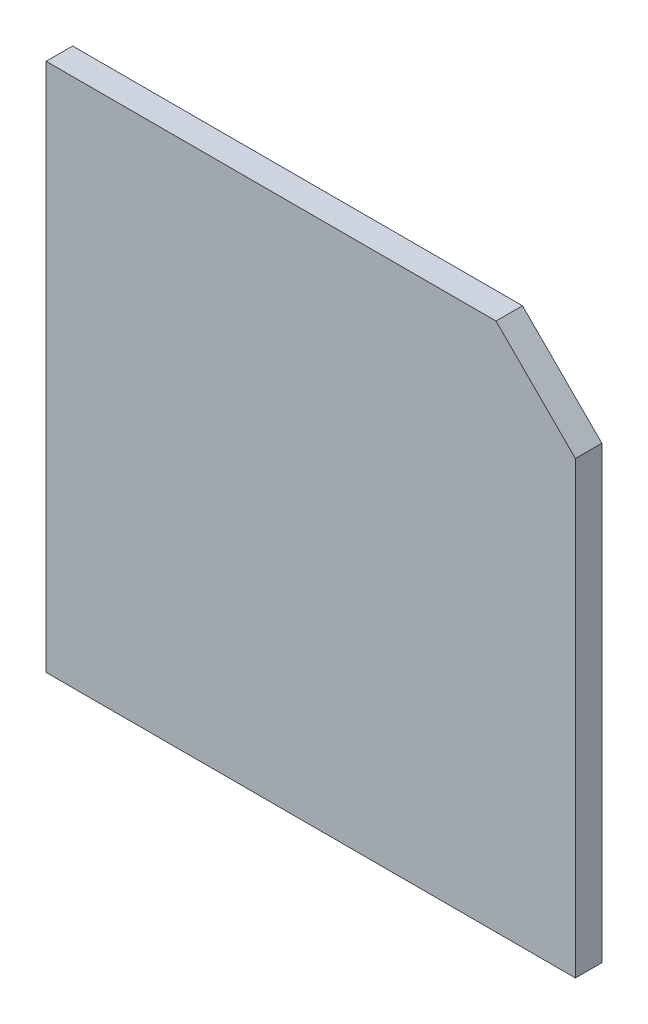
ISO-10303-21;
HEADER;
FILE_DESCRIPTION(('STEP AP214'),'2;1');
FILE_NAME('part.step','',(''),(''),'','','');
FILE_SCHEMA(('AUTOMOTIVE_DESIGN { 1 0 10303 214 1 1 1 1 }'));
ENDSEC;
DATA;
#1=APPLICATION_CONTEXT('core data for automotive mechanical design processes');
#2=APPLICATION_PROTOCOL_DEFINITION('international standard','automotive_design',2000,#1);
#3=PRODUCT_CONTEXT('',#1,'mechanical');
#4=PRODUCT('Part','Part','',(#3));
#5=PRODUCT_RELATED_PRODUCT_CATEGORY('part','',(#4));
#6=PRODUCT_DEFINITION_FORMATION('','',#4);
#7=PRODUCT_DEFINITION_CONTEXT('part definition',#1,'design');
#8=PRODUCT_DEFINITION('design','',#6,#7);
#9=PRODUCT_DEFINITION_SHAPE('','',#8);
#10=(LENGTH_UNIT() NAMED_UNIT(*) SI_UNIT(.MILLI.,.METRE.));
#11=(NAMED_UNIT(*) PLANE_ANGLE_UNIT() SI_UNIT($,.RADIAN.));
#12=(NAMED_UNIT(*) SI_UNIT($,.STERADIAN.) SOLID_ANGLE_UNIT());
#13=UNCERTAINTY_MEASURE_WITH_UNIT(LENGTH_MEASURE(1.E-05),#10,'distance_accuracy_value','');
#14=(GEOMETRIC_REPRESENTATION_CONTEXT(3) GLOBAL_UNCERTAINTY_ASSIGNED_CONTEXT((#13)) GLOBAL_UNIT_ASSIGNED_CONTEXT((#10,
#11,#12)) REPRESENTATION_CONTEXT('',''));
#15=CARTESIAN_POINT('',(0.,0.,0.));
#16=DIRECTION('',(0.,0.,1.));
#17=DIRECTION('',(1.,0.,0.));
#18=AXIS2_PLACEMENT_3D('',#15,#16,#17);
#19=CARTESIAN_POINT('',(-250.,-250.,25.));
#20=DIRECTION('',(1.,0.,0.));
#21=DIRECTION('',(0.,0.,-1.));
#22=AXIS2_PLACEMENT_3D('',#19,#20,#21);
#23=PLANE('',#22);
#24=DIRECTION('',(0.,-1.,0.));
#25=VECTOR('',#24,1.);
#26=CARTESIAN_POINT('',(-250.,-250.,0.));
#27=LINE('',#26,#25);
#28=CARTESIAN_POINT('',(-250.,250.,0.));
#29=VERTEX_POINT('',#28);
#30=CARTESIAN_POINT('',(-250.,-250.,0.));
#31=VERTEX_POINT('',#30);
#32=EDGE_CURVE('E107',#29,#31,#27,.T.);
#33=ORIENTED_EDGE('',*,*,#32,.T.);
#34=DIRECTION('',(0.,0.,-1.));
#35=VECTOR('',#34,1.);
#36=CARTESIAN_POINT('',(-250.,-250.,25.));
#37=LINE('',#36,#35);
#38=CARTESIAN_POINT('',(-250.,-250.,25.));
#39=VERTEX_POINT('',#38);
#40=EDGE_CURVE('E43',#39,#31,#37,.T.);
#41=ORIENTED_EDGE('',*,*,#40,.F.);
#42=DIRECTION('',(0.,-1.,0.));
#43=VECTOR('',#42,1.);
#44=CARTESIAN_POINT('',(-250.,-250.,25.));
#45=LINE('',#44,#43);
#46=CARTESIAN_POINT('',(-250.,250.,25.));
#47=VERTEX_POINT('',#46);
#48=EDGE_CURVE('E115',#47,#39,#45,.T.);
#49=ORIENTED_EDGE('',*,*,#48,.F.);
#50=DIRECTION('',(0.,0.,-1.));
#51=VECTOR('',#50,1.);
#52=CARTESIAN_POINT('',(-250.,250.,25.));
#53=LINE('',#52,#51);
#54=EDGE_CURVE('E99',#47,#29,#53,.T.);
#55=ORIENTED_EDGE('',*,*,#54,.T.);
#56=EDGE_LOOP('',(#33,#41,#49,#55));
#57=FACE_BOUND('',#56,.T.);
#58=ADVANCED_FACE('F36',(#57),#23,.F.);
#59=CARTESIAN_POINT('',(-250.,-250.,25.));
#60=DIRECTION('',(0.,1.,0.));
#61=DIRECTION('',(0.,0.,1.));
#62=AXIS2_PLACEMENT_3D('',#59,#60,#61);
#63=PLANE('',#62);
#64=DIRECTION('',(1.,0.,0.));
#65=VECTOR('',#64,1.);
#66=CARTESIAN_POINT('',(-250.,-250.,0.));
#67=LINE('',#66,#65);
#68=CARTESIAN_POINT('',(250.,-250.,0.));
#69=VERTEX_POINT('',#68);
#70=EDGE_CURVE('E110',#31,#69,#67,.T.);
#71=ORIENTED_EDGE('',*,*,#70,.T.);
#72=DIRECTION('',(0.,0.,-1.));
#73=VECTOR('',#72,1.);
#74=CARTESIAN_POINT('',(250.,-250.,25.));
#75=LINE('',#74,#73);
#76=CARTESIAN_POINT('',(250.,-250.,25.));
#77=VERTEX_POINT('',#76);
#78=EDGE_CURVE('E102',#77,#69,#75,.T.);
#79=ORIENTED_EDGE('',*,*,#78,.F.);
#80=DIRECTION('',(1.,0.,0.));
#81=VECTOR('',#80,1.);
#82=CARTESIAN_POINT('',(-250.,-250.,25.));
#83=LINE('',#82,#81);
#84=EDGE_CURVE('E82',#39,#77,#83,.T.);
#85=ORIENTED_EDGE('',*,*,#84,.F.);
#86=ORIENTED_EDGE('',*,*,#40,.T.);
#87=EDGE_LOOP('',(#71,#79,#85,#86));
#88=FACE_BOUND('',#87,.T.);
#89=ADVANCED_FACE('F119',(#88),#63,.F.);
#90=CARTESIAN_POINT('',(250.,250.,25.));
#91=DIRECTION('',(-1.,0.,0.));
#92=DIRECTION('',(0.,-1.,0.));
#93=AXIS2_PLACEMENT_3D('',#90,#91,#92);
#94=PLANE('',#93);
#95=DIRECTION('',(0.,1.,0.));
#96=VECTOR('',#95,1.);
#97=CARTESIAN_POINT('',(250.,250.,0.));
#98=LINE('',#97,#96);
#99=CARTESIAN_POINT('',(250.,175.,0.));
#100=VERTEX_POINT('',#99);
#101=EDGE_CURVE('E112',#69,#100,#98,.T.);
#102=ORIENTED_EDGE('',*,*,#101,.T.);
#103=DIRECTION('',(0.,0.,1.));
#104=VECTOR('',#103,1.);
#105=CARTESIAN_POINT('',(250.,175.,-0.399999999999998));
#106=LINE('',#105,#104);
#107=CARTESIAN_POINT('',(250.,175.,25.));
#108=VERTEX_POINT('',#107);
#109=EDGE_CURVE('E49',#100,#108,#106,.T.);
#110=ORIENTED_EDGE('',*,*,#109,.T.);
#111=DIRECTION('',(0.,1.,0.));
#112=VECTOR('',#111,1.);
#113=CARTESIAN_POINT('',(250.,250.,25.));
#114=LINE('',#113,#112);
#115=EDGE_CURVE('E96',#77,#108,#114,.T.);
#116=ORIENTED_EDGE('',*,*,#115,.F.);
#117=ORIENTED_EDGE('',*,*,#78,.T.);
#118=EDGE_LOOP('',(#102,#110,#116,#117));
#119=FACE_BOUND('',#118,.T.);
#120=ADVANCED_FACE('F126',(#119),#94,.F.);
#121=CARTESIAN_POINT('',(-250.,250.,25.));
#122=DIRECTION('',(0.,-1.,0.));
#123=DIRECTION('',(0.,0.,-1.));
#124=AXIS2_PLACEMENT_3D('',#121,#122,#123);
#125=PLANE('',#124);
#126=DIRECTION('',(-1.,0.,0.));
#127=VECTOR('',#126,1.);
#128=CARTESIAN_POINT('',(-250.,250.,25.));
#129=LINE('',#128,#127);
#130=CARTESIAN_POINT('',(175.,250.,25.));
#131=VERTEX_POINT('',#130);
#132=EDGE_CURVE('E58',#131,#47,#129,.T.);
#133=ORIENTED_EDGE('',*,*,#132,.F.);
#134=DIRECTION('',(0.,0.,1.));
#135=VECTOR('',#134,1.);
#136=CARTESIAN_POINT('',(175.,250.,-0.399999999999998));
#137=LINE('',#136,#135);
#138=CARTESIAN_POINT('',(175.,250.,0.));
#139=VERTEX_POINT('',#138);
#140=EDGE_CURVE('E89',#139,#131,#137,.T.);
#141=ORIENTED_EDGE('',*,*,#140,.F.);
#142=DIRECTION('',(-1.,0.,0.));
#143=VECTOR('',#142,1.);
#144=CARTESIAN_POINT('',(-250.,250.,0.));
#145=LINE('',#144,#143);
#146=EDGE_CURVE('E76',#139,#29,#145,.T.);
#147=ORIENTED_EDGE('',*,*,#146,.T.);
#148=ORIENTED_EDGE('',*,*,#54,.F.);
#149=EDGE_LOOP('',(#133,#141,#147,#148));
#150=FACE_BOUND('',#149,.T.);
#151=ADVANCED_FACE('F98',(#150),#125,.F.);
#152=CARTESIAN_POINT('',(0.,0.,25.));
#153=DIRECTION('',(0.,0.,-1.));
#154=DIRECTION('',(-1.,0.,0.));
#155=AXIS2_PLACEMENT_3D('',#152,#153,#154);
#156=PLANE('',#155);
#157=ORIENTED_EDGE('',*,*,#115,.T.);
#158=DIRECTION('',(0.707106781186547,-0.707106781186548,0.));
#159=VECTOR('',#158,1.);
#160=CARTESIAN_POINT('',(175.,250.,25.));
#161=LINE('',#160,#159);
#162=EDGE_CURVE('E91',#131,#108,#161,.T.);
#163=ORIENTED_EDGE('',*,*,#162,.F.);
#164=ORIENTED_EDGE('',*,*,#132,.T.);
#165=ORIENTED_EDGE('',*,*,#48,.T.);
#166=ORIENTED_EDGE('',*,*,#84,.T.);
#167=EDGE_LOOP('',(#157,#163,#164,#165,#166));
#168=FACE_BOUND('',#167,.T.);
#169=ADVANCED_FACE('F94',(#168),#156,.F.);
#170=CARTESIAN_POINT('',(0.,0.,0.));
#171=DIRECTION('',(0.,0.,-1.));
#172=DIRECTION('',(-1.,0.,0.));
#173=AXIS2_PLACEMENT_3D('',#170,#171,#172);
#174=PLANE('',#173);
#175=DIRECTION('',(-0.707106781186547,0.707106781186548,0.));
#176=VECTOR('',#175,1.);
#177=CARTESIAN_POINT('',(212.5,212.5,0.));
#178=LINE('',#177,#176);
#179=EDGE_CURVE('E11',#100,#139,#178,.T.);
#180=ORIENTED_EDGE('',*,*,#179,.F.);
#181=ORIENTED_EDGE('',*,*,#101,.F.);
#182=ORIENTED_EDGE('',*,*,#70,.F.);
#183=ORIENTED_EDGE('',*,*,#32,.F.);
#184=ORIENTED_EDGE('',*,*,#146,.F.);
#185=EDGE_LOOP('',(#180,#181,#182,#183,#184));
#186=FACE_BOUND('',#185,.T.);
#187=ADVANCED_FACE('F123',(#186),#174,.T.);
#188=CARTESIAN_POINT('',(175.,250.,-0.399999999999998));
#189=DIRECTION('',(-0.707106781186548,-0.707106781186547,0.));
#190=DIRECTION('',(0.707106781186547,-0.707106781186548,0.));
#191=AXIS2_PLACEMENT_3D('',#188,#189,#190);
#192=PLANE('',#191);
#193=ORIENTED_EDGE('',*,*,#179,.T.);
#194=ORIENTED_EDGE('',*,*,#140,.T.);
#195=ORIENTED_EDGE('',*,*,#162,.T.);
#196=ORIENTED_EDGE('',*,*,#109,.F.);
#197=EDGE_LOOP('',(#193,#194,#195,#196));
#198=FACE_BOUND('',#197,.T.);
#199=ADVANCED_FACE('F90',(#198),#192,.F.);
#200=CLOSED_SHELL('',(#58,#89,#120,#151,#169,#187,#199));
#201=MANIFOLD_SOLID_BREP('B2',#200);
#202=ADVANCED_BREP_SHAPE_REPRESENTATION('',(#18,#201),#14);
#203=SHAPE_DEFINITION_REPRESENTATION(#9,#202);
ENDSEC;
END-ISO-10303-21;
